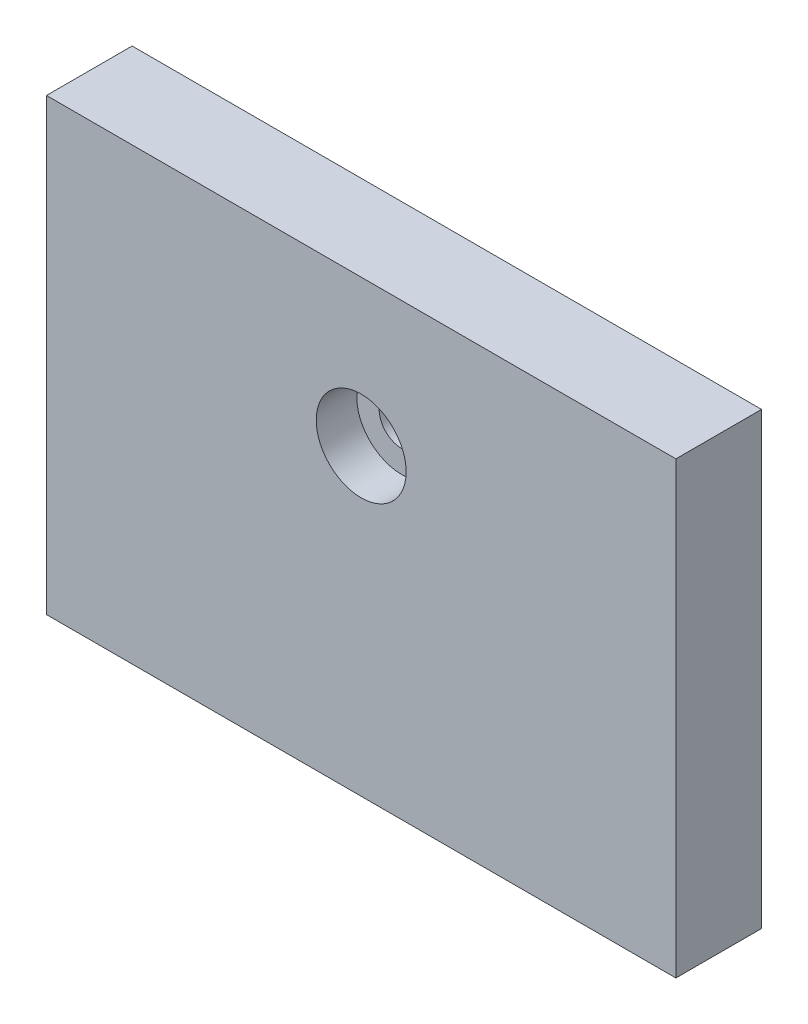
ISO-10303-21;
HEADER;
FILE_DESCRIPTION(('STEP AP214'),'2;1');
FILE_NAME('part.step','',(''),(''),'','','');
FILE_SCHEMA(('AUTOMOTIVE_DESIGN { 1 0 10303 214 1 1 1 1 }'));
ENDSEC;
DATA;
#1=APPLICATION_CONTEXT('core data for automotive mechanical design processes');
#2=APPLICATION_PROTOCOL_DEFINITION('international standard','automotive_design',2000,#1);
#3=PRODUCT_CONTEXT('',#1,'mechanical');
#4=PRODUCT('Part','Part','',(#3));
#5=PRODUCT_RELATED_PRODUCT_CATEGORY('part','',(#4));
#6=PRODUCT_DEFINITION_FORMATION('','',#4);
#7=PRODUCT_DEFINITION_CONTEXT('part definition',#1,'design');
#8=PRODUCT_DEFINITION('design','',#6,#7);
#9=PRODUCT_DEFINITION_SHAPE('','',#8);
#10=(LENGTH_UNIT() NAMED_UNIT(*) SI_UNIT(.MILLI.,.METRE.));
#11=(NAMED_UNIT(*) PLANE_ANGLE_UNIT() SI_UNIT($,.RADIAN.));
#12=(NAMED_UNIT(*) SI_UNIT($,.STERADIAN.) SOLID_ANGLE_UNIT());
#13=UNCERTAINTY_MEASURE_WITH_UNIT(LENGTH_MEASURE(1.E-05),#10,'distance_accuracy_value','');
#14=(GEOMETRIC_REPRESENTATION_CONTEXT(3) GLOBAL_UNCERTAINTY_ASSIGNED_CONTEXT((#13)) GLOBAL_UNIT_ASSIGNED_CONTEXT((#10,
#11,#12)) REPRESENTATION_CONTEXT('',''));
#15=CARTESIAN_POINT('',(0.,0.,0.));
#16=DIRECTION('',(0.,0.,1.));
#17=DIRECTION('',(1.,0.,0.));
#18=AXIS2_PLACEMENT_3D('',#15,#16,#17);
#19=CARTESIAN_POINT('',(0.,8.74239931545873,9.525));
#20=DIRECTION('',(0.,0.,-1.));
#21=DIRECTION('',(-1.,0.,0.));
#22=AXIS2_PLACEMENT_3D('',#19,#20,#21);
#23=CYLINDRICAL_SURFACE('',#22,2.5);
#24=CARTESIAN_POINT('',(0.,8.74239931545873,0.));
#25=DIRECTION('',(0.,0.,1.));
#26=DIRECTION('',(1.,0.,0.));
#27=AXIS2_PLACEMENT_3D('',#24,#25,#26);
#28=CIRCLE('',#27,2.5);
#29=CARTESIAN_POINT('',(-2.5,8.74239931545873,0.));
#30=VERTEX_POINT('',#29);
#31=EDGE_CURVE('E102',#30,#30,#28,.T.);
#32=CARTESIAN_POINT('',(0.,8.74239931545873,5.025));
#33=DIRECTION('',(0.,0.,1.));
#34=DIRECTION('',(1.,0.,0.));
#35=AXIS2_PLACEMENT_3D('',#32,#33,#34);
#36=CIRCLE('',#35,2.5);
#37=CARTESIAN_POINT('',(-2.5,8.74239931545873,5.025));
#38=VERTEX_POINT('',#37);
#39=EDGE_CURVE('E37',#38,#38,#36,.T.);
#40=CARTESIAN_POINT('',(-2.5,8.74239931545873,0.));
#41=CARTESIAN_POINT('',(-2.5,8.74239931545873,0.05234375));
#42=CARTESIAN_POINT('',(-2.5,8.74239931545873,0.1046875));
#43=CARTESIAN_POINT('',(-2.5,8.74239931545873,0.209375));
#44=CARTESIAN_POINT('',(-2.5,8.74239931545873,0.26171875));
#45=CARTESIAN_POINT('',(-2.5,8.74239931545873,0.36640625));
#46=CARTESIAN_POINT('',(-2.5,8.74239931545873,0.41875));
#47=CARTESIAN_POINT('',(-2.5,8.74239931545873,0.5234375));
#48=CARTESIAN_POINT('',(-2.5,8.74239931545873,0.57578125));
#49=CARTESIAN_POINT('',(-2.5,8.74239931545873,0.68046875));
#50=CARTESIAN_POINT('',(-2.5,8.74239931545873,0.7328125));
#51=CARTESIAN_POINT('',(-2.5,8.74239931545873,0.8375));
#52=CARTESIAN_POINT('',(-2.5,8.74239931545873,0.88984375));
#53=CARTESIAN_POINT('',(-2.5,8.74239931545873,0.99453125));
#54=CARTESIAN_POINT('',(-2.5,8.74239931545873,1.046875));
#55=CARTESIAN_POINT('',(-2.5,8.74239931545873,1.1515625));
#56=CARTESIAN_POINT('',(-2.5,8.74239931545873,1.20390625));
#57=CARTESIAN_POINT('',(-2.5,8.74239931545873,1.30859375));
#58=CARTESIAN_POINT('',(-2.5,8.74239931545873,1.3609375));
#59=CARTESIAN_POINT('',(-2.5,8.74239931545873,1.465625));
#60=CARTESIAN_POINT('',(-2.5,8.74239931545873,1.51796875));
#61=CARTESIAN_POINT('',(-2.5,8.74239931545873,1.62265625));
#62=CARTESIAN_POINT('',(-2.5,8.74239931545873,1.675));
#63=CARTESIAN_POINT('',(-2.5,8.74239931545873,1.7796875));
#64=CARTESIAN_POINT('',(-2.5,8.74239931545873,1.83203125));
#65=CARTESIAN_POINT('',(-2.5,8.74239931545873,1.93671875));
#66=CARTESIAN_POINT('',(-2.5,8.74239931545873,1.9890625));
#67=CARTESIAN_POINT('',(-2.5,8.74239931545873,2.09375));
#68=CARTESIAN_POINT('',(-2.5,8.74239931545873,2.14609375));
#69=CARTESIAN_POINT('',(-2.5,8.74239931545873,2.25078125));
#70=CARTESIAN_POINT('',(-2.5,8.74239931545873,2.303125));
#71=CARTESIAN_POINT('',(-2.5,8.74239931545873,2.4078125));
#72=CARTESIAN_POINT('',(-2.5,8.74239931545873,2.46015625));
#73=CARTESIAN_POINT('',(-2.5,8.74239931545873,2.56484375));
#74=CARTESIAN_POINT('',(-2.5,8.74239931545873,2.6171875));
#75=CARTESIAN_POINT('',(-2.5,8.74239931545873,2.721875));
#76=CARTESIAN_POINT('',(-2.5,8.74239931545873,2.77421875));
#77=CARTESIAN_POINT('',(-2.5,8.74239931545873,2.87890625));
#78=CARTESIAN_POINT('',(-2.5,8.74239931545873,2.93125));
#79=CARTESIAN_POINT('',(-2.5,8.74239931545873,3.0359375));
#80=CARTESIAN_POINT('',(-2.5,8.74239931545873,3.08828125));
#81=CARTESIAN_POINT('',(-2.5,8.74239931545873,3.19296875));
#82=CARTESIAN_POINT('',(-2.5,8.74239931545873,3.2453125));
#83=CARTESIAN_POINT('',(-2.5,8.74239931545873,3.35));
#84=CARTESIAN_POINT('',(-2.5,8.74239931545873,3.40234375));
#85=CARTESIAN_POINT('',(-2.5,8.74239931545873,3.50703125));
#86=CARTESIAN_POINT('',(-2.5,8.74239931545873,3.559375));
#87=CARTESIAN_POINT('',(-2.5,8.74239931545873,3.6640625));
#88=CARTESIAN_POINT('',(-2.5,8.74239931545873,3.71640625));
#89=CARTESIAN_POINT('',(-2.5,8.74239931545873,3.82109375));
#90=CARTESIAN_POINT('',(-2.5,8.74239931545873,3.8734375));
#91=CARTESIAN_POINT('',(-2.5,8.74239931545873,3.978125));
#92=CARTESIAN_POINT('',(-2.5,8.74239931545873,4.03046875));
#93=CARTESIAN_POINT('',(-2.5,8.74239931545873,4.13515625));
#94=CARTESIAN_POINT('',(-2.5,8.74239931545873,4.1875));
#95=CARTESIAN_POINT('',(-2.5,8.74239931545873,4.2921875));
#96=CARTESIAN_POINT('',(-2.5,8.74239931545873,4.34453125));
#97=CARTESIAN_POINT('',(-2.5,8.74239931545873,4.44921875));
#98=CARTESIAN_POINT('',(-2.5,8.74239931545873,4.5015625));
#99=CARTESIAN_POINT('',(-2.5,8.74239931545873,4.60625));
#100=CARTESIAN_POINT('',(-2.5,8.74239931545873,4.65859375));
#101=CARTESIAN_POINT('',(-2.5,8.74239931545873,4.76328125));
#102=CARTESIAN_POINT('',(-2.5,8.74239931545873,4.815625));
#103=CARTESIAN_POINT('',(-2.5,8.74239931545873,4.9203125));
#104=CARTESIAN_POINT('',(-2.5,8.74239931545873,4.97265625));
#105=CARTESIAN_POINT('',(-2.5,8.74239931545873,5.025));
#106=B_SPLINE_CURVE_WITH_KNOTS('',3,(#40,#41,#42,#43,#44,#45,#46,#47,#48,#49,#50,#51,#52,#53,
#54,#55,#56,#57,#58,#59,#60,#61,#62,#63,#64,#65,#66,#67,#68,#69,#70,#71,#72,#73,#74,#75,#76,#77,
#78,#79,#80,#81,#82,#83,#84,#85,#86,#87,#88,#89,#90,#91,#92,#93,#94,#95,#96,#97,#98,#99,#100,
#101,#102,#103,#104,#105),.UNSPECIFIED.,.F.,.F.,(4,2,2,2,2,2,2,2,2,2,2,2,2,2,2,2,2,2,2,2,2,2,2,
2,2,2,2,2,2,2,2,2,4),(0.,0.15703125,0.3140625,0.47109375,0.628125,0.78515625,0.9421875,
1.09921875,1.25625,1.41328125,1.5703125,1.72734375,1.884375,2.04140625,2.1984375,2.35546875,
2.5125,2.66953125,2.8265625,2.98359375,3.140625,3.29765625,3.4546875,3.61171875,3.76875,
3.92578125,4.0828125,4.23984375,4.396875,4.55390625,4.7109375,4.86796875,5.025),.UNSPECIFIED.);
#107=EDGE_CURVE('BSEAM33',#30,#38,#106,.T.);
#108=ORIENTED_EDGE('',*,*,#31,.F.);
#109=ORIENTED_EDGE('',*,*,#39,.T.);
#110=ORIENTED_EDGE('',*,*,#107,.T.);
#111=ORIENTED_EDGE('',*,*,#107,.F.);
#112=EDGE_LOOP('',(#108,#110,#109,#111));
#113=FACE_BOUND('',#112,.T.);
#114=ADVANCED_FACE('F33',(#113),#23,.F.);
#115=CARTESIAN_POINT('',(0.,0.,9.525));
#116=DIRECTION('',(0.,0.,1.));
#117=DIRECTION('',(1.,0.,0.));
#118=AXIS2_PLACEMENT_3D('',#115,#116,#117);
#119=PLANE('',#118);
#120=CARTESIAN_POINT('',(0.,8.74239931545873,9.525));
#121=DIRECTION('',(0.,0.,1.));
#122=DIRECTION('',(1.,0.,0.));
#123=AXIS2_PLACEMENT_3D('',#120,#121,#122);
#124=CIRCLE('',#123,5.);
#125=CARTESIAN_POINT('',(5.,8.74239931545873,9.525));
#126=VERTEX_POINT('',#125);
#127=EDGE_CURVE('E116',#126,#126,#124,.T.);
#128=ORIENTED_EDGE('',*,*,#127,.F.);
#129=EDGE_LOOP('',(#128));
#130=FACE_BOUND('',#129,.T.);
#131=DIRECTION('',(0.,-1.,0.));
#132=VECTOR('',#131,1.);
#133=CARTESIAN_POINT('',(-35.,-25.,9.525));
#134=LINE('',#133,#132);
#135=CARTESIAN_POINT('',(-35.,25.,9.525));
#136=VERTEX_POINT('',#135);
#137=CARTESIAN_POINT('',(-35.,-25.,9.525));
#138=VERTEX_POINT('',#137);
#139=EDGE_CURVE('E86',#136,#138,#134,.T.);
#140=ORIENTED_EDGE('',*,*,#139,.T.);
#141=DIRECTION('',(1.,0.,0.));
#142=VECTOR('',#141,1.);
#143=CARTESIAN_POINT('',(35.,-25.,9.525));
#144=LINE('',#143,#142);
#145=CARTESIAN_POINT('',(35.,-25.,9.525));
#146=VERTEX_POINT('',#145);
#147=EDGE_CURVE('E81',#138,#146,#144,.T.);
#148=ORIENTED_EDGE('',*,*,#147,.T.);
#149=DIRECTION('',(0.,1.,0.));
#150=VECTOR('',#149,1.);
#151=CARTESIAN_POINT('',(35.,-25.,9.525));
#152=LINE('',#151,#150);
#153=CARTESIAN_POINT('',(35.,25.,9.525));
#154=VERTEX_POINT('',#153);
#155=EDGE_CURVE('E84',#146,#154,#152,.T.);
#156=ORIENTED_EDGE('',*,*,#155,.T.);
#157=DIRECTION('',(-1.,0.,0.));
#158=VECTOR('',#157,1.);
#159=CARTESIAN_POINT('',(35.,25.,9.525));
#160=LINE('',#159,#158);
#161=EDGE_CURVE('E51',#154,#136,#160,.T.);
#162=ORIENTED_EDGE('',*,*,#161,.T.);
#163=EDGE_LOOP('',(#140,#148,#156,#162));
#164=FACE_BOUND('',#163,.T.);
#165=ADVANCED_FACE('F82',(#130,#164),#119,.T.);
#166=CARTESIAN_POINT('',(0.,0.,0.));
#167=DIRECTION('',(0.,0.,1.));
#168=DIRECTION('',(1.,0.,0.));
#169=AXIS2_PLACEMENT_3D('',#166,#167,#168);
#170=PLANE('',#169);
#171=DIRECTION('',(0.,-1.,0.));
#172=VECTOR('',#171,1.);
#173=CARTESIAN_POINT('',(-35.,-25.,0.));
#174=LINE('',#173,#172);
#175=CARTESIAN_POINT('',(-35.,25.,0.));
#176=VERTEX_POINT('',#175);
#177=CARTESIAN_POINT('',(-35.,-25.,0.));
#178=VERTEX_POINT('',#177);
#179=EDGE_CURVE('E99',#176,#178,#174,.T.);
#180=ORIENTED_EDGE('',*,*,#179,.F.);
#181=DIRECTION('',(-1.,0.,0.));
#182=VECTOR('',#181,1.);
#183=CARTESIAN_POINT('',(35.,25.,0.));
#184=LINE('',#183,#182);
#185=CARTESIAN_POINT('',(35.,25.,0.));
#186=VERTEX_POINT('',#185);
#187=EDGE_CURVE('E74',#186,#176,#184,.T.);
#188=ORIENTED_EDGE('',*,*,#187,.F.);
#189=DIRECTION('',(0.,1.,0.));
#190=VECTOR('',#189,1.);
#191=CARTESIAN_POINT('',(35.,-25.,0.));
#192=LINE('',#191,#190);
#193=CARTESIAN_POINT('',(35.,-25.,0.));
#194=VERTEX_POINT('',#193);
#195=EDGE_CURVE('E68',#194,#186,#192,.T.);
#196=ORIENTED_EDGE('',*,*,#195,.F.);
#197=DIRECTION('',(1.,0.,0.));
#198=VECTOR('',#197,1.);
#199=CARTESIAN_POINT('',(35.,-25.,0.));
#200=LINE('',#199,#198);
#201=EDGE_CURVE('E90',#178,#194,#200,.T.);
#202=ORIENTED_EDGE('',*,*,#201,.F.);
#203=EDGE_LOOP('',(#180,#188,#196,#202));
#204=FACE_BOUND('',#203,.T.);
#205=ORIENTED_EDGE('',*,*,#31,.T.);
#206=EDGE_LOOP('',(#205));
#207=FACE_BOUND('',#206,.T.);
#208=ADVANCED_FACE('F110',(#204,#207),#170,.F.);
#209=CARTESIAN_POINT('',(-35.,-25.,9.525));
#210=DIRECTION('',(1.,0.,0.));
#211=DIRECTION('',(0.,0.,-1.));
#212=AXIS2_PLACEMENT_3D('',#209,#210,#211);
#213=PLANE('',#212);
#214=ORIENTED_EDGE('',*,*,#179,.T.);
#215=DIRECTION('',(0.,0.,-1.));
#216=VECTOR('',#215,1.);
#217=CARTESIAN_POINT('',(-35.,-25.,9.525));
#218=LINE('',#217,#216);
#219=EDGE_CURVE('E11',#138,#178,#218,.T.);
#220=ORIENTED_EDGE('',*,*,#219,.F.);
#221=ORIENTED_EDGE('',*,*,#139,.F.);
#222=DIRECTION('',(0.,0.,-1.));
#223=VECTOR('',#222,1.);
#224=CARTESIAN_POINT('',(-35.,25.,9.525));
#225=LINE('',#224,#223);
#226=EDGE_CURVE('E95',#136,#176,#225,.T.);
#227=ORIENTED_EDGE('',*,*,#226,.T.);
#228=EDGE_LOOP('',(#214,#220,#221,#227));
#229=FACE_BOUND('',#228,.T.);
#230=ADVANCED_FACE('F35',(#229),#213,.F.);
#231=CARTESIAN_POINT('',(35.,-25.,9.525));
#232=DIRECTION('',(0.,1.,0.));
#233=DIRECTION('',(-1.,0.,0.));
#234=AXIS2_PLACEMENT_3D('',#231,#232,#233);
#235=PLANE('',#234);
#236=ORIENTED_EDGE('',*,*,#201,.T.);
#237=DIRECTION('',(0.,0.,-1.));
#238=VECTOR('',#237,1.);
#239=CARTESIAN_POINT('',(35.,-25.,9.525));
#240=LINE('',#239,#238);
#241=EDGE_CURVE('E43',#146,#194,#240,.T.);
#242=ORIENTED_EDGE('',*,*,#241,.F.);
#243=ORIENTED_EDGE('',*,*,#147,.F.);
#244=ORIENTED_EDGE('',*,*,#219,.T.);
#245=EDGE_LOOP('',(#236,#242,#243,#244));
#246=FACE_BOUND('',#245,.T.);
#247=ADVANCED_FACE('F89',(#246),#235,.F.);
#248=CARTESIAN_POINT('',(35.,-25.,9.525));
#249=DIRECTION('',(-1.,0.,0.));
#250=DIRECTION('',(0.,0.,1.));
#251=AXIS2_PLACEMENT_3D('',#248,#249,#250);
#252=PLANE('',#251);
#253=ORIENTED_EDGE('',*,*,#195,.T.);
#254=DIRECTION('',(0.,0.,-1.));
#255=VECTOR('',#254,1.);
#256=CARTESIAN_POINT('',(35.,25.,9.525));
#257=LINE('',#256,#255);
#258=EDGE_CURVE('E91',#154,#186,#257,.T.);
#259=ORIENTED_EDGE('',*,*,#258,.F.);
#260=ORIENTED_EDGE('',*,*,#155,.F.);
#261=ORIENTED_EDGE('',*,*,#241,.T.);
#262=EDGE_LOOP('',(#253,#259,#260,#261));
#263=FACE_BOUND('',#262,.T.);
#264=ADVANCED_FACE('F93',(#263),#252,.F.);
#265=CARTESIAN_POINT('',(35.,25.,9.525));
#266=DIRECTION('',(0.,-1.,0.));
#267=DIRECTION('',(1.,0.,0.));
#268=AXIS2_PLACEMENT_3D('',#265,#266,#267);
#269=PLANE('',#268);
#270=ORIENTED_EDGE('',*,*,#187,.T.);
#271=ORIENTED_EDGE('',*,*,#226,.F.);
#272=ORIENTED_EDGE('',*,*,#161,.F.);
#273=ORIENTED_EDGE('',*,*,#258,.T.);
#274=EDGE_LOOP('',(#270,#271,#272,#273));
#275=FACE_BOUND('',#274,.T.);
#276=ADVANCED_FACE('F107',(#275),#269,.F.);
#277=CARTESIAN_POINT('',(0.,8.74239931545873,5.025));
#278=DIRECTION('',(0.,0.,1.));
#279=DIRECTION('',(1.,0.,0.));
#280=AXIS2_PLACEMENT_3D('',#277,#278,#279);
#281=CYLINDRICAL_SURFACE('',#280,5.);
#282=CARTESIAN_POINT('',(0.,8.74239931545873,5.025));
#283=DIRECTION('',(0.,0.,1.));
#284=DIRECTION('',(1.,0.,0.));
#285=AXIS2_PLACEMENT_3D('',#282,#283,#284);
#286=CIRCLE('',#285,5.);
#287=CARTESIAN_POINT('',(5.,8.74239931545873,5.025));
#288=VERTEX_POINT('',#287);
#289=EDGE_CURVE('E119',#288,#288,#286,.T.);
#290=ORIENTED_EDGE('',*,*,#289,.F.);
#291=EDGE_LOOP('',(#290));
#292=FACE_BOUND('',#291,.T.);
#293=ORIENTED_EDGE('',*,*,#127,.T.);
#294=EDGE_LOOP('',(#293));
#295=FACE_BOUND('',#294,.T.);
#296=ADVANCED_FACE('F129',(#292,#295),#281,.F.);
#297=CARTESIAN_POINT('',(0.,8.74239931545873,5.025));
#298=DIRECTION('',(0.,0.,1.));
#299=DIRECTION('',(1.,0.,0.));
#300=AXIS2_PLACEMENT_3D('',#297,#298,#299);
#301=PLANE('',#300);
#302=ORIENTED_EDGE('',*,*,#39,.F.);
#303=EDGE_LOOP('',(#302));
#304=FACE_BOUND('',#303,.T.);
#305=ORIENTED_EDGE('',*,*,#289,.T.);
#306=EDGE_LOOP('',(#305));
#307=FACE_BOUND('',#306,.T.);
#308=ADVANCED_FACE('F127',(#304,#307),#301,.T.);
#309=CLOSED_SHELL('',(#114,#165,#208,#230,#247,#264,#276,#296,#308));
#310=MANIFOLD_SOLID_BREP('B2',#309);
#311=ADVANCED_BREP_SHAPE_REPRESENTATION('',(#18,#310),#14);
#312=SHAPE_DEFINITION_REPRESENTATION(#9,#311);
ENDSEC;
END-ISO-10303-21;
